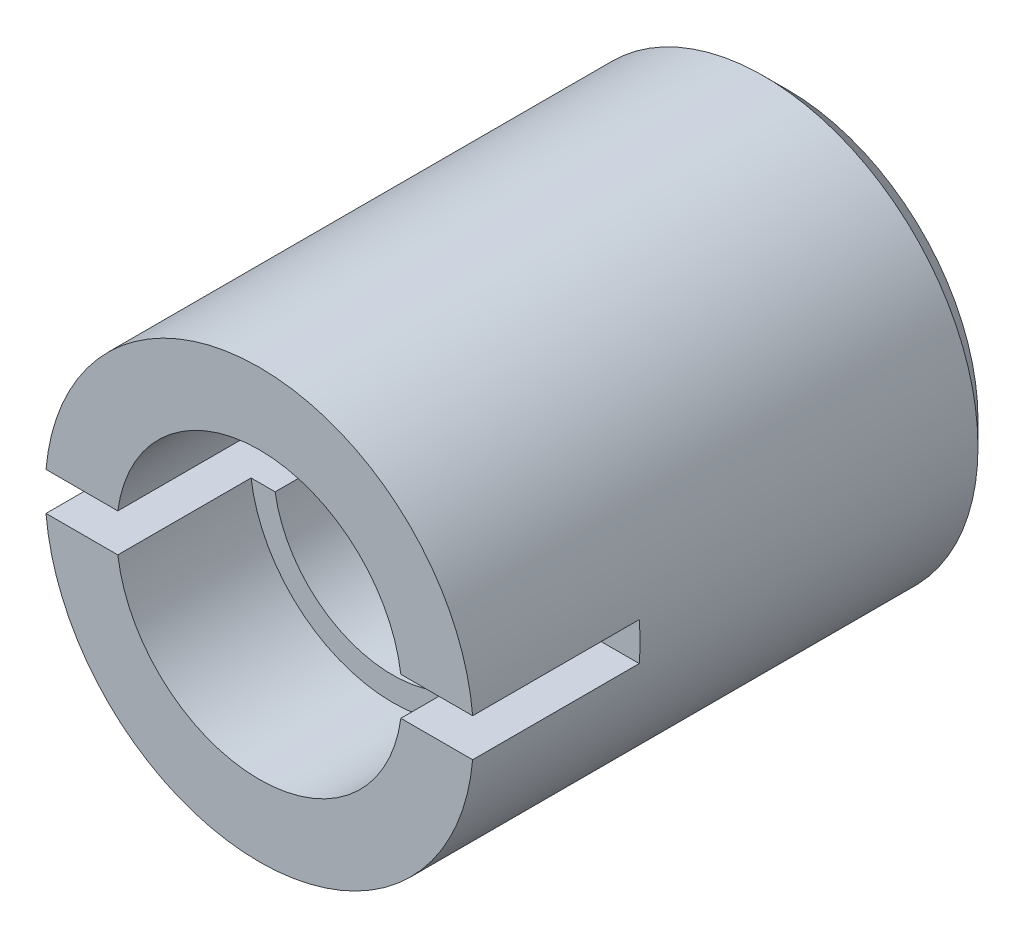
ISO-10303-21;
HEADER;
FILE_DESCRIPTION(('STEP AP214'),'2;1');
FILE_NAME('part.step','',(''),(''),'','','');
FILE_SCHEMA(('AUTOMOTIVE_DESIGN { 1 0 10303 214 1 1 1 1 }'));
ENDSEC;
DATA;
#1=APPLICATION_CONTEXT('core data for automotive mechanical design processes');
#2=APPLICATION_PROTOCOL_DEFINITION('international standard','automotive_design',2000,#1);
#3=PRODUCT_CONTEXT('',#1,'mechanical');
#4=PRODUCT('Part','Part','',(#3));
#5=PRODUCT_RELATED_PRODUCT_CATEGORY('part','',(#4));
#6=PRODUCT_DEFINITION_FORMATION('','',#4);
#7=PRODUCT_DEFINITION_CONTEXT('part definition',#1,'design');
#8=PRODUCT_DEFINITION('design','',#6,#7);
#9=PRODUCT_DEFINITION_SHAPE('','',#8);
#10=(LENGTH_UNIT() NAMED_UNIT(*) SI_UNIT(.MILLI.,.METRE.));
#11=(NAMED_UNIT(*) PLANE_ANGLE_UNIT() SI_UNIT($,.RADIAN.));
#12=(NAMED_UNIT(*) SI_UNIT($,.STERADIAN.) SOLID_ANGLE_UNIT());
#13=UNCERTAINTY_MEASURE_WITH_UNIT(LENGTH_MEASURE(1.E-05),#10,'distance_accuracy_value','');
#14=(GEOMETRIC_REPRESENTATION_CONTEXT(3) GLOBAL_UNCERTAINTY_ASSIGNED_CONTEXT((#13)) GLOBAL_UNIT_ASSIGNED_CONTEXT((#10,
#11,#12)) REPRESENTATION_CONTEXT('',''));
#15=CARTESIAN_POINT('',(0.,0.,0.));
#16=DIRECTION('',(0.,0.,1.));
#17=DIRECTION('',(1.,0.,0.));
#18=AXIS2_PLACEMENT_3D('',#15,#16,#17);
#19=CARTESIAN_POINT('',(0.,0.,8.8));
#20=DIRECTION('',(0.,0.,1.));
#21=DIRECTION('',(1.,0.,0.));
#22=AXIS2_PLACEMENT_3D('',#19,#20,#21);
#23=PLANE('',#22);
#24=DIRECTION('',(1.,0.,0.));
#25=VECTOR('',#24,1.);
#26=CARTESIAN_POINT('',(0.,-0.4,8.8));
#27=LINE('',#26,#25);
#28=CARTESIAN_POINT('',(-2.9732137494637,-0.400000000000001,8.8));
#29=VERTEX_POINT('',#28);
#30=CARTESIAN_POINT('',(-2.46779253585061,-0.4,8.8));
#31=VERTEX_POINT('',#30);
#32=EDGE_CURVE('E176',#29,#31,#27,.T.);
#33=ORIENTED_EDGE('',*,*,#32,.F.);
#34=CARTESIAN_POINT('',(0.,0.,8.8));
#35=DIRECTION('',(0.,0.,1.));
#36=DIRECTION('',(1.,0.,0.));
#37=AXIS2_PLACEMENT_3D('',#34,#35,#36);
#38=CIRCLE('',#37,3.);
#39=CARTESIAN_POINT('',(2.9732137494637,-0.400000000000001,8.8));
#40=VERTEX_POINT('',#39);
#41=EDGE_CURVE('E192',#29,#40,#38,.T.);
#42=ORIENTED_EDGE('',*,*,#41,.T.);
#43=CARTESIAN_POINT('',(2.46779253585061,-0.4,8.8));
#44=VERTEX_POINT('',#43);
#45=EDGE_CURVE('E172',#44,#40,#27,.T.);
#46=ORIENTED_EDGE('',*,*,#45,.F.);
#47=CARTESIAN_POINT('',(0.,0.,8.8));
#48=DIRECTION('',(0.,0.,1.));
#49=DIRECTION('',(1.,0.,0.));
#50=AXIS2_PLACEMENT_3D('',#47,#48,#49);
#51=CIRCLE('',#50,2.5);
#52=EDGE_CURVE('E199',#31,#44,#51,.T.);
#53=ORIENTED_EDGE('',*,*,#52,.F.);
#54=EDGE_LOOP('',(#33,#42,#46,#53));
#55=FACE_BOUND('',#54,.T.);
#56=ADVANCED_FACE('F41',(#55),#23,.T.);
#57=CARTESIAN_POINT('',(0.,0.,11.6));
#58=DIRECTION('',(0.,0.,1.));
#59=DIRECTION('',(1.,0.,0.));
#60=AXIS2_PLACEMENT_3D('',#57,#58,#59);
#61=PLANE('',#60);
#62=CARTESIAN_POINT('',(0.,0.,11.6));
#63=DIRECTION('',(0.,0.,1.));
#64=DIRECTION('',(1.,0.,0.));
#65=AXIS2_PLACEMENT_3D('',#62,#63,#64);
#66=CIRCLE('',#65,4.5);
#67=CARTESIAN_POINT('',(4.48218696620299,0.400000000000001,11.6));
#68=VERTEX_POINT('',#67);
#69=CARTESIAN_POINT('',(-4.48218696620299,0.400000000000001,11.6));
#70=VERTEX_POINT('',#69);
#71=EDGE_CURVE('E195',#68,#70,#66,.T.);
#72=ORIENTED_EDGE('',*,*,#71,.T.);
#73=DIRECTION('',(1.,0.,0.));
#74=VECTOR('',#73,1.);
#75=CARTESIAN_POINT('',(-4.5,0.400000000000001,11.6));
#76=LINE('',#75,#74);
#77=CARTESIAN_POINT('',(-2.9732137494637,0.400000000000001,11.6));
#78=VERTEX_POINT('',#77);
#79=EDGE_CURVE('E149',#70,#78,#76,.T.);
#80=ORIENTED_EDGE('',*,*,#79,.T.);
#81=CARTESIAN_POINT('',(0.,0.,11.6));
#82=DIRECTION('',(0.,0.,1.));
#83=DIRECTION('',(1.,0.,0.));
#84=AXIS2_PLACEMENT_3D('',#81,#82,#83);
#85=CIRCLE('',#84,3.);
#86=CARTESIAN_POINT('',(2.9732137494637,0.400000000000001,11.6));
#87=VERTEX_POINT('',#86);
#88=EDGE_CURVE('E184',#87,#78,#85,.T.);
#89=ORIENTED_EDGE('',*,*,#88,.F.);
#90=EDGE_CURVE('E64',#87,#68,#76,.T.);
#91=ORIENTED_EDGE('',*,*,#90,.T.);
#92=EDGE_LOOP('',(#72,#80,#89,#91));
#93=FACE_BOUND('',#92,.T.);
#94=ADVANCED_FACE('F262',(#93),#61,.T.);
#95=CARTESIAN_POINT('',(0.,0.,11.6));
#96=DIRECTION('',(0.,0.,-1.));
#97=DIRECTION('',(-1.,0.,0.));
#98=AXIS2_PLACEMENT_3D('',#95,#96,#97);
#99=CYLINDRICAL_SURFACE('',#98,3.);
#100=DIRECTION('',(0.,0.,-1.));
#101=VECTOR('',#100,1.);
#102=CARTESIAN_POINT('',(-2.9732137494637,-0.400000000000001,11.6));
#103=LINE('',#102,#101);
#104=CARTESIAN_POINT('',(-2.9732137494637,-0.400000000000001,11.6));
#105=VERTEX_POINT('',#104);
#106=EDGE_CURVE('E226',#105,#29,#103,.T.);
#107=ORIENTED_EDGE('',*,*,#106,.F.);
#108=CARTESIAN_POINT('',(2.9732137494637,-0.400000000000001,11.6));
#109=VERTEX_POINT('',#108);
#110=EDGE_CURVE('E187',#105,#109,#85,.T.);
#111=ORIENTED_EDGE('',*,*,#110,.T.);
#112=DIRECTION('',(0.,0.,-1.));
#113=VECTOR('',#112,1.);
#114=CARTESIAN_POINT('',(2.9732137494637,-0.400000000000001,11.6));
#115=LINE('',#114,#113);
#116=EDGE_CURVE('E223',#40,#109,#115,.F.);
#117=ORIENTED_EDGE('',*,*,#116,.F.);
#118=ORIENTED_EDGE('',*,*,#41,.F.);
#119=EDGE_LOOP('',(#107,#111,#117,#118));
#120=FACE_BOUND('',#119,.T.);
#121=ADVANCED_FACE('F242',(#120),#99,.F.);
#122=DIRECTION('',(-1.,0.,0.));
#123=VECTOR('',#122,1.);
#124=CARTESIAN_POINT('',(0.,0.4,8.8));
#125=LINE('',#124,#123);
#126=CARTESIAN_POINT('',(2.9732137494637,0.400000000000001,8.8));
#127=VERTEX_POINT('',#126);
#128=CARTESIAN_POINT('',(2.46779253585061,0.4,8.8));
#129=VERTEX_POINT('',#128);
#130=EDGE_CURVE('E169',#127,#129,#125,.T.);
#131=ORIENTED_EDGE('',*,*,#130,.F.);
#132=CARTESIAN_POINT('',(-2.9732137494637,0.400000000000001,8.8));
#133=VERTEX_POINT('',#132);
#134=EDGE_CURVE('E188',#127,#133,#38,.T.);
#135=ORIENTED_EDGE('',*,*,#134,.T.);
#136=CARTESIAN_POINT('',(-2.46779253585061,0.4,8.8));
#137=VERTEX_POINT('',#136);
#138=EDGE_CURVE('E60',#137,#133,#125,.T.);
#139=ORIENTED_EDGE('',*,*,#138,.F.);
#140=EDGE_CURVE('E198',#129,#137,#51,.T.);
#141=ORIENTED_EDGE('',*,*,#140,.F.);
#142=EDGE_LOOP('',(#131,#135,#139,#141));
#143=FACE_BOUND('',#142,.T.);
#144=ADVANCED_FACE('F271',(#143),#23,.T.);
#145=CARTESIAN_POINT('',(0.,0.,6.6));
#146=DIRECTION('',(0.,0.,1.));
#147=DIRECTION('',(1.,0.,0.));
#148=AXIS2_PLACEMENT_3D('',#145,#146,#147);
#149=PLANE('',#148);
#150=CARTESIAN_POINT('',(0.,0.,6.6));
#151=DIRECTION('',(0.,0.,1.));
#152=DIRECTION('',(1.,0.,0.));
#153=AXIS2_PLACEMENT_3D('',#150,#151,#152);
#154=CIRCLE('',#153,1.4);
#155=CARTESIAN_POINT('',(1.4,0.,6.6));
#156=VERTEX_POINT('',#155);
#157=EDGE_CURVE('E200',#156,#156,#154,.T.);
#158=ORIENTED_EDGE('',*,*,#157,.F.);
#159=EDGE_LOOP('',(#158));
#160=FACE_BOUND('',#159,.T.);
#161=CARTESIAN_POINT('',(0.,0.,6.6));
#162=DIRECTION('',(0.,0.,1.));
#163=DIRECTION('',(1.,0.,0.));
#164=AXIS2_PLACEMENT_3D('',#161,#162,#163);
#165=CIRCLE('',#164,2.5);
#166=CARTESIAN_POINT('',(2.5,0.,6.6));
#167=VERTEX_POINT('',#166);
#168=EDGE_CURVE('E203',#167,#167,#165,.T.);
#169=ORIENTED_EDGE('',*,*,#168,.T.);
#170=EDGE_LOOP('',(#169));
#171=FACE_BOUND('',#170,.T.);
#172=ADVANCED_FACE('F272',(#160,#171),#149,.T.);
#173=CARTESIAN_POINT('',(0.,0.,0.));
#174=DIRECTION('',(0.,0.,1.));
#175=DIRECTION('',(1.,0.,0.));
#176=AXIS2_PLACEMENT_3D('',#173,#174,#175);
#177=PLANE('',#176);
#178=CARTESIAN_POINT('',(0.,0.,0.));
#179=DIRECTION('',(0.,0.,1.));
#180=DIRECTION('',(1.,0.,0.));
#181=AXIS2_PLACEMENT_3D('',#178,#179,#180);
#182=CIRCLE('',#181,2.75);
#183=CARTESIAN_POINT('',(2.75,0.,0.));
#184=VERTEX_POINT('',#183);
#185=EDGE_CURVE('E207',#184,#184,#182,.T.);
#186=ORIENTED_EDGE('',*,*,#185,.F.);
#187=EDGE_LOOP('',(#186));
#188=FACE_BOUND('',#187,.T.);
#189=CARTESIAN_POINT('',(0.,0.,0.));
#190=DIRECTION('',(0.,0.,1.));
#191=DIRECTION('',(1.,0.,0.));
#192=AXIS2_PLACEMENT_3D('',#189,#190,#191);
#193=CIRCLE('',#192,1.4);
#194=CARTESIAN_POINT('',(1.4,0.,0.));
#195=VERTEX_POINT('',#194);
#196=EDGE_CURVE('E206',#195,#195,#193,.T.);
#197=ORIENTED_EDGE('',*,*,#196,.T.);
#198=EDGE_LOOP('',(#197));
#199=FACE_BOUND('',#198,.T.);
#200=ADVANCED_FACE('F278',(#188,#199),#177,.F.);
#201=CARTESIAN_POINT('',(0.,0.,0.5));
#202=DIRECTION('',(0.,0.,-1.));
#203=DIRECTION('',(-1.,0.,0.));
#204=AXIS2_PLACEMENT_3D('',#201,#202,#203);
#205=CYLINDRICAL_SURFACE('',#204,2.75);
#206=CARTESIAN_POINT('',(0.,0.,0.5));
#207=DIRECTION('',(0.,0.,1.));
#208=DIRECTION('',(1.,0.,0.));
#209=AXIS2_PLACEMENT_3D('',#206,#207,#208);
#210=CIRCLE('',#209,2.75);
#211=CARTESIAN_POINT('',(2.75,0.,0.5));
#212=VERTEX_POINT('',#211);
#213=EDGE_CURVE('E209',#212,#212,#210,.T.);
#214=ORIENTED_EDGE('',*,*,#213,.F.);
#215=EDGE_LOOP('',(#214));
#216=FACE_BOUND('',#215,.T.);
#217=ORIENTED_EDGE('',*,*,#185,.T.);
#218=EDGE_LOOP('',(#217));
#219=FACE_BOUND('',#218,.T.);
#220=ADVANCED_FACE('F316',(#216,#219),#205,.T.);
#221=CARTESIAN_POINT('',(0.,0.,0.5));
#222=DIRECTION('',(0.,0.,-1.));
#223=DIRECTION('',(-1.,0.,0.));
#224=AXIS2_PLACEMENT_3D('',#221,#222,#223);
#225=CYLINDRICAL_SURFACE('',#224,1.4);
#226=ORIENTED_EDGE('',*,*,#196,.F.);
#227=EDGE_LOOP('',(#226));
#228=FACE_BOUND('',#227,.T.);
#229=ORIENTED_EDGE('',*,*,#157,.T.);
#230=EDGE_LOOP('',(#229));
#231=FACE_BOUND('',#230,.T.);
#232=ADVANCED_FACE('F315',(#228,#231),#225,.F.);
#233=CARTESIAN_POINT('',(0.,0.,0.5));
#234=DIRECTION('',(0.,0.,1.));
#235=DIRECTION('',(1.,0.,0.));
#236=AXIS2_PLACEMENT_3D('',#233,#234,#235);
#237=PLANE('',#236);
#238=CARTESIAN_POINT('',(0.,0.,0.5));
#239=DIRECTION('',(0.,0.,1.));
#240=DIRECTION('',(1.,0.,0.));
#241=AXIS2_PLACEMENT_3D('',#238,#239,#240);
#242=CIRCLE('',#241,4.);
#243=CARTESIAN_POINT('',(4.,0.,0.5));
#244=VERTEX_POINT('',#243);
#245=EDGE_CURVE('E217',#244,#244,#242,.F.);
#246=ORIENTED_EDGE('',*,*,#245,.T.);
#247=EDGE_LOOP('',(#246));
#248=FACE_BOUND('',#247,.T.);
#249=ORIENTED_EDGE('',*,*,#213,.T.);
#250=EDGE_LOOP('',(#249));
#251=FACE_BOUND('',#250,.T.);
#252=ADVANCED_FACE('F303',(#248,#251),#237,.F.);
#253=CARTESIAN_POINT('',(0.,0.,6.6));
#254=DIRECTION('',(0.,0.,-1.));
#255=DIRECTION('',(-1.,0.,0.));
#256=AXIS2_PLACEMENT_3D('',#253,#254,#255);
#257=CYLINDRICAL_SURFACE('',#256,4.5);
#258=CARTESIAN_POINT('',(0.,0.,0.999999999999999));
#259=DIRECTION('',(0.,0.,1.));
#260=DIRECTION('',(1.,0.,0.));
#261=AXIS2_PLACEMENT_3D('',#258,#259,#260);
#262=CIRCLE('',#261,4.5);
#263=CARTESIAN_POINT('',(4.5,0.,0.999999999999999));
#264=VERTEX_POINT('',#263);
#265=EDGE_CURVE('E213',#264,#264,#262,.T.);
#266=ORIENTED_EDGE('',*,*,#265,.T.);
#267=EDGE_LOOP('',(#266));
#268=FACE_BOUND('',#267,.T.);
#269=CARTESIAN_POINT('',(0.,0.,8.1));
#270=DIRECTION('',(0.,0.,-1.));
#271=DIRECTION('',(-1.,0.,0.));
#272=AXIS2_PLACEMENT_3D('',#269,#270,#271);
#273=CIRCLE('',#272,4.5);
#274=CARTESIAN_POINT('',(-4.48218696620299,-0.4,8.1));
#275=VERTEX_POINT('',#274);
#276=CARTESIAN_POINT('',(-4.48218696620299,0.4,8.1));
#277=VERTEX_POINT('',#276);
#278=EDGE_CURVE('E128',#275,#277,#273,.T.);
#279=ORIENTED_EDGE('',*,*,#278,.T.);
#280=DIRECTION('',(0.,0.,-1.));
#281=VECTOR('',#280,1.);
#282=CARTESIAN_POINT('',(-4.48218696620299,0.4,6.6));
#283=LINE('',#282,#281);
#284=EDGE_CURVE('E133',#277,#70,#283,.F.);
#285=ORIENTED_EDGE('',*,*,#284,.T.);
#286=ORIENTED_EDGE('',*,*,#71,.F.);
#287=DIRECTION('',(0.,0.,-1.));
#288=VECTOR('',#287,1.);
#289=CARTESIAN_POINT('',(4.48218696620299,0.4,6.6));
#290=LINE('',#289,#288);
#291=CARTESIAN_POINT('',(4.48218696620299,0.4,8.1));
#292=VERTEX_POINT('',#291);
#293=EDGE_CURVE('E147',#68,#292,#290,.T.);
#294=ORIENTED_EDGE('',*,*,#293,.T.);
#295=CARTESIAN_POINT('',(4.48218696620299,-0.4,8.1));
#296=VERTEX_POINT('',#295);
#297=EDGE_CURVE('E142',#292,#296,#273,.T.);
#298=ORIENTED_EDGE('',*,*,#297,.T.);
#299=DIRECTION('',(0.,0.,-1.));
#300=VECTOR('',#299,1.);
#301=CARTESIAN_POINT('',(4.48218696620299,-0.4,6.6));
#302=LINE('',#301,#300);
#303=CARTESIAN_POINT('',(4.48218696620299,-0.400000000000001,11.6));
#304=VERTEX_POINT('',#303);
#305=EDGE_CURVE('E180',#296,#304,#302,.F.);
#306=ORIENTED_EDGE('',*,*,#305,.T.);
#307=CARTESIAN_POINT('',(-4.48218696620299,-0.400000000000001,11.6));
#308=VERTEX_POINT('',#307);
#309=EDGE_CURVE('E190',#308,#304,#66,.T.);
#310=ORIENTED_EDGE('',*,*,#309,.F.);
#311=DIRECTION('',(0.,0.,-1.));
#312=VECTOR('',#311,1.);
#313=CARTESIAN_POINT('',(-4.48218696620299,-0.4,6.6));
#314=LINE('',#313,#312);
#315=EDGE_CURVE('E137',#308,#275,#314,.T.);
#316=ORIENTED_EDGE('',*,*,#315,.T.);
#317=EDGE_LOOP('',(#279,#285,#286,#294,#298,#306,#310,#316));
#318=FACE_BOUND('',#317,.T.);
#319=ADVANCED_FACE('F135',(#268,#318),#257,.T.);
#320=CARTESIAN_POINT('',(0.,0.,0.999999999999999));
#321=DIRECTION('',(0.,0.,1.));
#322=DIRECTION('',(1.,0.,0.));
#323=AXIS2_PLACEMENT_3D('',#320,#321,#322);
#324=CONICAL_SURFACE('',#323,4.5,0.785398163397452);
#325=ORIENTED_EDGE('',*,*,#245,.F.);
#326=EDGE_LOOP('',(#325));
#327=FACE_BOUND('',#326,.T.);
#328=ORIENTED_EDGE('',*,*,#265,.F.);
#329=EDGE_LOOP('',(#328));
#330=FACE_BOUND('',#329,.T.);
#331=ADVANCED_FACE('F42',(#327,#330),#324,.T.);
#332=CARTESIAN_POINT('',(0.,0.,8.8));
#333=DIRECTION('',(0.,0.,-1.));
#334=DIRECTION('',(-1.,0.,0.));
#335=AXIS2_PLACEMENT_3D('',#332,#333,#334);
#336=CYLINDRICAL_SURFACE('',#335,2.5);
#337=DIRECTION('',(0.,0.,-1.));
#338=VECTOR('',#337,1.);
#339=CARTESIAN_POINT('',(2.46779253585061,-0.4,8.8));
#340=LINE('',#339,#338);
#341=CARTESIAN_POINT('',(2.46779253585061,-0.4,8.1));
#342=VERTEX_POINT('',#341);
#343=EDGE_CURVE('E174',#342,#44,#340,.F.);
#344=ORIENTED_EDGE('',*,*,#343,.F.);
#345=CARTESIAN_POINT('',(0.,0.,8.1));
#346=DIRECTION('',(0.,0.,-1.));
#347=DIRECTION('',(-1.,0.,0.));
#348=AXIS2_PLACEMENT_3D('',#345,#346,#347);
#349=CIRCLE('',#348,2.5);
#350=CARTESIAN_POINT('',(2.46779253585061,0.4,8.1));
#351=VERTEX_POINT('',#350);
#352=EDGE_CURVE('E11',#351,#342,#349,.T.);
#353=ORIENTED_EDGE('',*,*,#352,.F.);
#354=DIRECTION('',(0.,0.,-1.));
#355=VECTOR('',#354,1.);
#356=CARTESIAN_POINT('',(2.46779253585061,0.4,8.8));
#357=LINE('',#356,#355);
#358=EDGE_CURVE('E151',#129,#351,#357,.T.);
#359=ORIENTED_EDGE('',*,*,#358,.F.);
#360=ORIENTED_EDGE('',*,*,#140,.T.);
#361=DIRECTION('',(0.,0.,-1.));
#362=VECTOR('',#361,1.);
#363=CARTESIAN_POINT('',(-2.46779253585061,0.4,8.8));
#364=LINE('',#363,#362);
#365=CARTESIAN_POINT('',(-2.46779253585061,0.4,8.1));
#366=VERTEX_POINT('',#365);
#367=EDGE_CURVE('E167',#366,#137,#364,.F.);
#368=ORIENTED_EDGE('',*,*,#367,.F.);
#369=CARTESIAN_POINT('',(-2.46779253585061,-0.4,8.1));
#370=VERTEX_POINT('',#369);
#371=EDGE_CURVE('E46',#370,#366,#349,.T.);
#372=ORIENTED_EDGE('',*,*,#371,.F.);
#373=DIRECTION('',(0.,0.,-1.));
#374=VECTOR('',#373,1.);
#375=CARTESIAN_POINT('',(-2.46779253585061,-0.4,8.8));
#376=LINE('',#375,#374);
#377=EDGE_CURVE('E179',#31,#370,#376,.T.);
#378=ORIENTED_EDGE('',*,*,#377,.F.);
#379=ORIENTED_EDGE('',*,*,#52,.T.);
#380=EDGE_LOOP('',(#344,#353,#359,#360,#368,#372,#378,#379));
#381=FACE_BOUND('',#380,.T.);
#382=ORIENTED_EDGE('',*,*,#168,.F.);
#383=EDGE_LOOP('',(#382));
#384=FACE_BOUND('',#383,.T.);
#385=ADVANCED_FACE('F260',(#381,#384),#336,.F.);
#386=DIRECTION('',(1.,0.,0.));
#387=VECTOR('',#386,1.);
#388=CARTESIAN_POINT('',(-4.5,-0.400000000000001,11.6));
#389=LINE('',#388,#387);
#390=EDGE_CURVE('E170',#308,#105,#389,.T.);
#391=ORIENTED_EDGE('',*,*,#390,.F.);
#392=ORIENTED_EDGE('',*,*,#309,.T.);
#393=EDGE_CURVE('E252',#109,#304,#389,.T.);
#394=ORIENTED_EDGE('',*,*,#393,.F.);
#395=ORIENTED_EDGE('',*,*,#110,.F.);
#396=EDGE_LOOP('',(#391,#392,#394,#395));
#397=FACE_BOUND('',#396,.T.);
#398=ADVANCED_FACE('F261',(#397),#61,.T.);
#399=DIRECTION('',(0.,0.,-1.));
#400=VECTOR('',#399,1.);
#401=CARTESIAN_POINT('',(2.9732137494637,0.400000000000001,11.6));
#402=LINE('',#401,#400);
#403=EDGE_CURVE('E224',#87,#127,#402,.T.);
#404=ORIENTED_EDGE('',*,*,#403,.F.);
#405=ORIENTED_EDGE('',*,*,#88,.T.);
#406=DIRECTION('',(0.,0.,-1.));
#407=VECTOR('',#406,1.);
#408=CARTESIAN_POINT('',(-2.9732137494637,0.400000000000001,11.6));
#409=LINE('',#408,#407);
#410=EDGE_CURVE('E222',#133,#78,#409,.F.);
#411=ORIENTED_EDGE('',*,*,#410,.F.);
#412=ORIENTED_EDGE('',*,*,#134,.F.);
#413=EDGE_LOOP('',(#404,#405,#411,#412));
#414=FACE_BOUND('',#413,.T.);
#415=ADVANCED_FACE('F266',(#414),#99,.F.);
#416=CARTESIAN_POINT('',(-4.5,-0.400000000000001,11.6));
#417=DIRECTION('',(0.,-1.,0.));
#418=DIRECTION('',(0.,0.,-1.));
#419=AXIS2_PLACEMENT_3D('',#416,#417,#418);
#420=PLANE('',#419);
#421=ORIENTED_EDGE('',*,*,#390,.T.);
#422=ORIENTED_EDGE('',*,*,#106,.T.);
#423=ORIENTED_EDGE('',*,*,#32,.T.);
#424=ORIENTED_EDGE('',*,*,#377,.T.);
#425=DIRECTION('',(1.,0.,0.));
#426=VECTOR('',#425,1.);
#427=CARTESIAN_POINT('',(-4.5,-0.4,8.1));
#428=LINE('',#427,#426);
#429=EDGE_CURVE('E157',#275,#370,#428,.T.);
#430=ORIENTED_EDGE('',*,*,#429,.F.);
#431=ORIENTED_EDGE('',*,*,#315,.F.);
#432=EDGE_LOOP('',(#421,#422,#423,#424,#430,#431));
#433=FACE_BOUND('',#432,.T.);
#434=ADVANCED_FACE('F229',(#433),#420,.F.);
#435=CARTESIAN_POINT('',(-4.5,0.400000000000001,11.6));
#436=DIRECTION('',(0.,1.,0.));
#437=DIRECTION('',(0.,0.,1.));
#438=AXIS2_PLACEMENT_3D('',#435,#436,#437);
#439=PLANE('',#438);
#440=DIRECTION('',(1.,0.,0.));
#441=VECTOR('',#440,1.);
#442=CARTESIAN_POINT('',(-4.5,0.4,8.1));
#443=LINE('',#442,#441);
#444=EDGE_CURVE('E148',#277,#366,#443,.T.);
#445=ORIENTED_EDGE('',*,*,#444,.T.);
#446=ORIENTED_EDGE('',*,*,#367,.T.);
#447=ORIENTED_EDGE('',*,*,#138,.T.);
#448=ORIENTED_EDGE('',*,*,#410,.T.);
#449=ORIENTED_EDGE('',*,*,#79,.F.);
#450=ORIENTED_EDGE('',*,*,#284,.F.);
#451=EDGE_LOOP('',(#445,#446,#447,#448,#449,#450));
#452=FACE_BOUND('',#451,.T.);
#453=ADVANCED_FACE('F144',(#452),#439,.F.);
#454=CARTESIAN_POINT('',(-4.5,-0.4,8.1));
#455=DIRECTION('',(0.,0.,-1.));
#456=DIRECTION('',(-1.,0.,0.));
#457=AXIS2_PLACEMENT_3D('',#454,#455,#456);
#458=PLANE('',#457);
#459=ORIENTED_EDGE('',*,*,#278,.F.);
#460=ORIENTED_EDGE('',*,*,#429,.T.);
#461=ORIENTED_EDGE('',*,*,#371,.T.);
#462=ORIENTED_EDGE('',*,*,#444,.F.);
#463=EDGE_LOOP('',(#459,#460,#461,#462));
#464=FACE_BOUND('',#463,.T.);
#465=ADVANCED_FACE('F153',(#464),#458,.F.);
#466=EDGE_CURVE('E154',#351,#292,#443,.T.);
#467=ORIENTED_EDGE('',*,*,#466,.F.);
#468=ORIENTED_EDGE('',*,*,#352,.T.);
#469=EDGE_CURVE('E165',#342,#296,#428,.T.);
#470=ORIENTED_EDGE('',*,*,#469,.T.);
#471=ORIENTED_EDGE('',*,*,#297,.F.);
#472=EDGE_LOOP('',(#467,#468,#470,#471));
#473=FACE_BOUND('',#472,.T.);
#474=ADVANCED_FACE('F251',(#473),#458,.F.);
#475=ORIENTED_EDGE('',*,*,#469,.F.);
#476=ORIENTED_EDGE('',*,*,#343,.T.);
#477=ORIENTED_EDGE('',*,*,#45,.T.);
#478=ORIENTED_EDGE('',*,*,#116,.T.);
#479=ORIENTED_EDGE('',*,*,#393,.T.);
#480=ORIENTED_EDGE('',*,*,#305,.F.);
#481=EDGE_LOOP('',(#475,#476,#477,#478,#479,#480));
#482=FACE_BOUND('',#481,.T.);
#483=ADVANCED_FACE('F248',(#482),#420,.F.);
#484=ORIENTED_EDGE('',*,*,#90,.F.);
#485=ORIENTED_EDGE('',*,*,#403,.T.);
#486=ORIENTED_EDGE('',*,*,#130,.T.);
#487=ORIENTED_EDGE('',*,*,#358,.T.);
#488=ORIENTED_EDGE('',*,*,#466,.T.);
#489=ORIENTED_EDGE('',*,*,#293,.F.);
#490=EDGE_LOOP('',(#484,#485,#486,#487,#488,#489));
#491=FACE_BOUND('',#490,.T.);
#492=ADVANCED_FACE('F267',(#491),#439,.F.);
#493=CLOSED_SHELL('',(#56,#94,#121,#144,#172,#200,#220,#232,#252,#319,#331,#385,#398,#415,#434,
#453,#465,#474,#483,#492));
#494=MANIFOLD_SOLID_BREP('B2',#493);
#495=ADVANCED_BREP_SHAPE_REPRESENTATION('',(#18,#494),#14);
#496=SHAPE_DEFINITION_REPRESENTATION(#9,#495);
ENDSEC;
END-ISO-10303-21;
